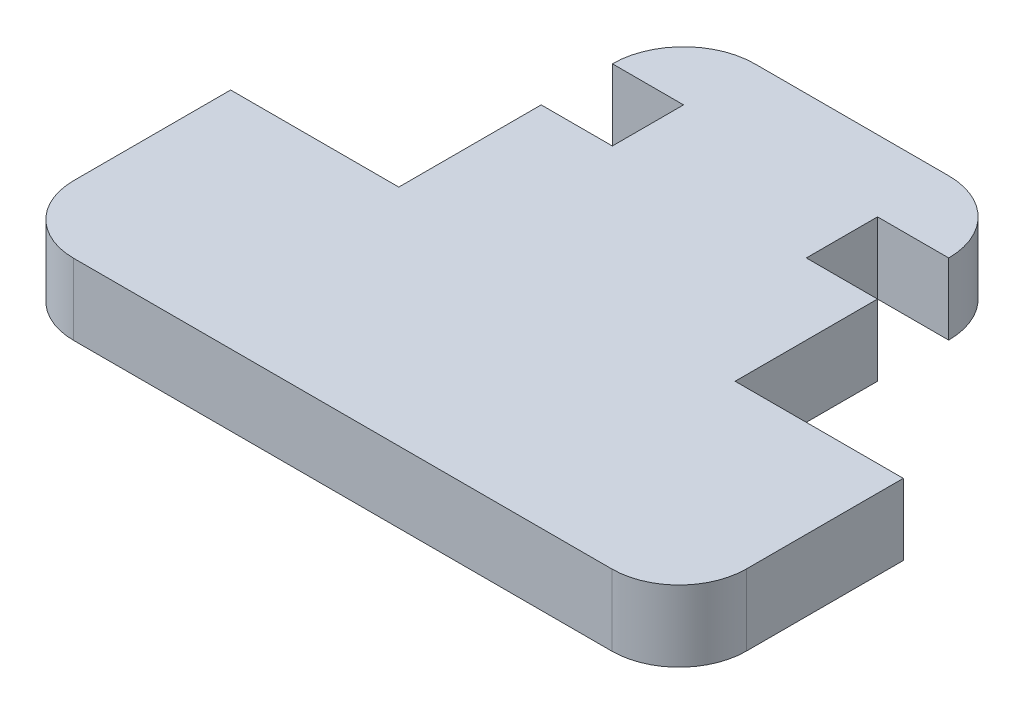
ISO-10303-21;
HEADER;
FILE_DESCRIPTION(('STEP AP214'),'2;1');
FILE_NAME('part.step','',(''),(''),'','','');
FILE_SCHEMA(('AUTOMOTIVE_DESIGN { 1 0 10303 214 1 1 1 1 }'));
ENDSEC;
DATA;
#1=APPLICATION_CONTEXT('core data for automotive mechanical design processes');
#2=APPLICATION_PROTOCOL_DEFINITION('international standard','automotive_design',2000,#1);
#3=PRODUCT_CONTEXT('',#1,'mechanical');
#4=PRODUCT('Part','Part','',(#3));
#5=PRODUCT_RELATED_PRODUCT_CATEGORY('part','',(#4));
#6=PRODUCT_DEFINITION_FORMATION('','',#4);
#7=PRODUCT_DEFINITION_CONTEXT('part definition',#1,'design');
#8=PRODUCT_DEFINITION('design','',#6,#7);
#9=PRODUCT_DEFINITION_SHAPE('','',#8);
#10=(LENGTH_UNIT() NAMED_UNIT(*) SI_UNIT(.MILLI.,.METRE.));
#11=(NAMED_UNIT(*) PLANE_ANGLE_UNIT() SI_UNIT($,.RADIAN.));
#12=(NAMED_UNIT(*) SI_UNIT($,.STERADIAN.) SOLID_ANGLE_UNIT());
#13=UNCERTAINTY_MEASURE_WITH_UNIT(LENGTH_MEASURE(1.E-05),#10,'distance_accuracy_value','');
#14=(GEOMETRIC_REPRESENTATION_CONTEXT(3) GLOBAL_UNCERTAINTY_ASSIGNED_CONTEXT((#13)) GLOBAL_UNIT_ASSIGNED_CONTEXT((#10,
#11,#12)) REPRESENTATION_CONTEXT('',''));
#15=CARTESIAN_POINT('',(0.,0.,0.));
#16=DIRECTION('',(0.,0.,1.));
#17=DIRECTION('',(1.,0.,0.));
#18=AXIS2_PLACEMENT_3D('',#15,#16,#17);
#19=CARTESIAN_POINT('',(0.,3.175,0.));
#20=DIRECTION('',(0.,0.,-1.));
#21=DIRECTION('',(-1.,0.,0.));
#22=AXIS2_PLACEMENT_3D('',#19,#20,#21);
#23=PLANE('',#22);
#24=DIRECTION('',(1.,0.,0.));
#25=VECTOR('',#24,1.);
#26=CARTESIAN_POINT('',(0.,0.,0.));
#27=LINE('',#26,#25);
#28=CARTESIAN_POINT('',(-15.,0.,0.));
#29=VERTEX_POINT('',#28);
#30=CARTESIAN_POINT('',(-7.5,0.,0.));
#31=VERTEX_POINT('',#30);
#32=EDGE_CURVE('E168',#29,#31,#27,.T.);
#33=ORIENTED_EDGE('',*,*,#32,.F.);
#34=DIRECTION('',(0.,-1.,0.));
#35=VECTOR('',#34,1.);
#36=CARTESIAN_POINT('',(-15.,3.175,0.));
#37=LINE('',#36,#35);
#38=CARTESIAN_POINT('',(-15.,3.175,0.));
#39=VERTEX_POINT('',#38);
#40=EDGE_CURVE('E163',#39,#29,#37,.T.);
#41=ORIENTED_EDGE('',*,*,#40,.F.);
#42=DIRECTION('',(1.,0.,0.));
#43=VECTOR('',#42,1.);
#44=CARTESIAN_POINT('',(0.,3.175,0.));
#45=LINE('',#44,#43);
#46=CARTESIAN_POINT('',(-7.5,3.175,0.));
#47=VERTEX_POINT('',#46);
#48=EDGE_CURVE('E165',#39,#47,#45,.T.);
#49=ORIENTED_EDGE('',*,*,#48,.T.);
#50=DIRECTION('',(0.,-1.,0.));
#51=VECTOR('',#50,1.);
#52=CARTESIAN_POINT('',(-7.5,3.175,0.));
#53=LINE('',#52,#51);
#54=EDGE_CURVE('E226',#47,#31,#53,.T.);
#55=ORIENTED_EDGE('',*,*,#54,.T.);
#56=EDGE_LOOP('',(#33,#41,#49,#55));
#57=FACE_BOUND('',#56,.T.);
#58=ADVANCED_FACE('F36',(#57),#23,.T.);
#59=CARTESIAN_POINT('',(-15.,3.175,0.));
#60=DIRECTION('',(1.,0.,0.));
#61=DIRECTION('',(0.,0.,-1.));
#62=AXIS2_PLACEMENT_3D('',#59,#60,#61);
#63=PLANE('',#62);
#64=DIRECTION('',(0.,0.,1.));
#65=VECTOR('',#64,1.);
#66=CARTESIAN_POINT('',(-15.,0.,0.));
#67=LINE('',#66,#65);
#68=CARTESIAN_POINT('',(-15.,0.,7.));
#69=VERTEX_POINT('',#68);
#70=EDGE_CURVE('E228',#29,#69,#67,.T.);
#71=ORIENTED_EDGE('',*,*,#70,.T.);
#72=DIRECTION('',(0.,-1.,0.));
#73=VECTOR('',#72,1.);
#74=CARTESIAN_POINT('',(-15.,3.175,7.));
#75=LINE('',#74,#73);
#76=CARTESIAN_POINT('',(-15.,3.175,7.));
#77=VERTEX_POINT('',#76);
#78=EDGE_CURVE('E11',#69,#77,#75,.F.);
#79=ORIENTED_EDGE('',*,*,#78,.T.);
#80=DIRECTION('',(0.,0.,1.));
#81=VECTOR('',#80,1.);
#82=CARTESIAN_POINT('',(-15.,3.175,0.));
#83=LINE('',#82,#81);
#84=EDGE_CURVE('E173',#39,#77,#83,.T.);
#85=ORIENTED_EDGE('',*,*,#84,.F.);
#86=ORIENTED_EDGE('',*,*,#40,.T.);
#87=EDGE_LOOP('',(#71,#79,#85,#86));
#88=FACE_BOUND('',#87,.T.);
#89=ADVANCED_FACE('F174',(#88),#63,.F.);
#90=CARTESIAN_POINT('',(0.,3.175,10.));
#91=DIRECTION('',(0.,0.,-1.));
#92=DIRECTION('',(-1.,0.,0.));
#93=AXIS2_PLACEMENT_3D('',#90,#91,#92);
#94=PLANE('',#93);
#95=DIRECTION('',(1.,0.,0.));
#96=VECTOR('',#95,1.);
#97=CARTESIAN_POINT('',(0.,0.,10.));
#98=LINE('',#97,#96);
#99=CARTESIAN_POINT('',(-12.,0.,10.));
#100=VERTEX_POINT('',#99);
#101=CARTESIAN_POINT('',(12.,0.,10.));
#102=VERTEX_POINT('',#101);
#103=EDGE_CURVE('E231',#100,#102,#98,.T.);
#104=ORIENTED_EDGE('',*,*,#103,.T.);
#105=DIRECTION('',(0.,-1.,0.));
#106=VECTOR('',#105,1.);
#107=CARTESIAN_POINT('',(12.,3.175,10.));
#108=LINE('',#107,#106);
#109=CARTESIAN_POINT('',(12.,3.175,10.));
#110=VERTEX_POINT('',#109);
#111=EDGE_CURVE('E57',#102,#110,#108,.F.);
#112=ORIENTED_EDGE('',*,*,#111,.T.);
#113=DIRECTION('',(1.,0.,0.));
#114=VECTOR('',#113,1.);
#115=CARTESIAN_POINT('',(0.,3.175,10.));
#116=LINE('',#115,#114);
#117=CARTESIAN_POINT('',(-12.,3.175,10.));
#118=VERTEX_POINT('',#117);
#119=EDGE_CURVE('E177',#118,#110,#116,.T.);
#120=ORIENTED_EDGE('',*,*,#119,.F.);
#121=DIRECTION('',(0.,-1.,0.));
#122=VECTOR('',#121,1.);
#123=CARTESIAN_POINT('',(-12.,3.175,10.));
#124=LINE('',#123,#122);
#125=EDGE_CURVE('E290',#118,#100,#124,.T.);
#126=ORIENTED_EDGE('',*,*,#125,.T.);
#127=EDGE_LOOP('',(#104,#112,#120,#126));
#128=FACE_BOUND('',#127,.T.);
#129=ADVANCED_FACE('F355',(#128),#94,.F.);
#130=CARTESIAN_POINT('',(15.,3.175,0.));
#131=DIRECTION('',(1.,0.,0.));
#132=DIRECTION('',(0.,0.,-1.));
#133=AXIS2_PLACEMENT_3D('',#130,#131,#132);
#134=PLANE('',#133);
#135=DIRECTION('',(0.,0.,1.));
#136=VECTOR('',#135,1.);
#137=CARTESIAN_POINT('',(15.,3.175,0.));
#138=LINE('',#137,#136);
#139=CARTESIAN_POINT('',(15.,3.175,0.));
#140=VERTEX_POINT('',#139);
#141=CARTESIAN_POINT('',(15.,3.175,7.));
#142=VERTEX_POINT('',#141);
#143=EDGE_CURVE('E191',#140,#142,#138,.T.);
#144=ORIENTED_EDGE('',*,*,#143,.T.);
#145=DIRECTION('',(0.,-1.,0.));
#146=VECTOR('',#145,1.);
#147=CARTESIAN_POINT('',(15.,0.,7.));
#148=LINE('',#147,#146);
#149=CARTESIAN_POINT('',(15.,0.,7.));
#150=VERTEX_POINT('',#149);
#151=EDGE_CURVE('E170',#142,#150,#148,.T.);
#152=ORIENTED_EDGE('',*,*,#151,.T.);
#153=DIRECTION('',(0.,0.,1.));
#154=VECTOR('',#153,1.);
#155=CARTESIAN_POINT('',(15.,0.,0.));
#156=LINE('',#155,#154);
#157=CARTESIAN_POINT('',(15.,0.,0.));
#158=VERTEX_POINT('',#157);
#159=EDGE_CURVE('E233',#158,#150,#156,.T.);
#160=ORIENTED_EDGE('',*,*,#159,.F.);
#161=DIRECTION('',(0.,-1.,0.));
#162=VECTOR('',#161,1.);
#163=CARTESIAN_POINT('',(15.,3.175,0.));
#164=LINE('',#163,#162);
#165=EDGE_CURVE('E171',#140,#158,#164,.T.);
#166=ORIENTED_EDGE('',*,*,#165,.F.);
#167=EDGE_LOOP('',(#144,#152,#160,#166));
#168=FACE_BOUND('',#167,.T.);
#169=ADVANCED_FACE('F299',(#168),#134,.T.);
#170=CARTESIAN_POINT('',(7.5,0.,0.));
#171=VERTEX_POINT('',#170);
#172=EDGE_CURVE('E229',#171,#158,#27,.T.);
#173=ORIENTED_EDGE('',*,*,#172,.F.);
#174=DIRECTION('',(0.,-1.,0.));
#175=VECTOR('',#174,1.);
#176=CARTESIAN_POINT('',(7.5,3.175,0.));
#177=LINE('',#176,#175);
#178=CARTESIAN_POINT('',(7.5,3.175,0.));
#179=VERTEX_POINT('',#178);
#180=EDGE_CURVE('E282',#179,#171,#177,.T.);
#181=ORIENTED_EDGE('',*,*,#180,.F.);
#182=EDGE_CURVE('E185',#179,#140,#45,.T.);
#183=ORIENTED_EDGE('',*,*,#182,.T.);
#184=ORIENTED_EDGE('',*,*,#165,.T.);
#185=EDGE_LOOP('',(#173,#181,#183,#184));
#186=FACE_BOUND('',#185,.T.);
#187=ADVANCED_FACE('F306',(#186),#23,.T.);
#188=CARTESIAN_POINT('',(7.5,3.175,0.));
#189=DIRECTION('',(-1.,0.,0.));
#190=DIRECTION('',(0.,0.,1.));
#191=AXIS2_PLACEMENT_3D('',#188,#189,#190);
#192=PLANE('',#191);
#193=DIRECTION('',(0.,0.,-1.));
#194=VECTOR('',#193,1.);
#195=CARTESIAN_POINT('',(7.5,0.,0.));
#196=LINE('',#195,#194);
#197=CARTESIAN_POINT('',(7.5,0.,-6.35));
#198=VERTEX_POINT('',#197);
#199=EDGE_CURVE('E236',#171,#198,#196,.T.);
#200=ORIENTED_EDGE('',*,*,#199,.T.);
#201=DIRECTION('',(0.,-1.,0.));
#202=VECTOR('',#201,1.);
#203=CARTESIAN_POINT('',(7.5,3.175,-6.35));
#204=LINE('',#203,#202);
#205=CARTESIAN_POINT('',(7.5,3.175,-6.35));
#206=VERTEX_POINT('',#205);
#207=EDGE_CURVE('E280',#206,#198,#204,.T.);
#208=ORIENTED_EDGE('',*,*,#207,.F.);
#209=DIRECTION('',(0.,0.,-1.));
#210=VECTOR('',#209,1.);
#211=CARTESIAN_POINT('',(7.5,3.175,0.));
#212=LINE('',#211,#210);
#213=EDGE_CURVE('E190',#179,#206,#212,.T.);
#214=ORIENTED_EDGE('',*,*,#213,.F.);
#215=ORIENTED_EDGE('',*,*,#180,.T.);
#216=EDGE_LOOP('',(#200,#208,#214,#215));
#217=FACE_BOUND('',#216,.T.);
#218=ADVANCED_FACE('F310',(#217),#192,.F.);
#219=CARTESIAN_POINT('',(0.,3.175,-6.35));
#220=DIRECTION('',(0.,0.,-1.));
#221=DIRECTION('',(-1.,0.,0.));
#222=AXIS2_PLACEMENT_3D('',#219,#220,#221);
#223=PLANE('',#222);
#224=DIRECTION('',(1.,0.,0.));
#225=VECTOR('',#224,1.);
#226=CARTESIAN_POINT('',(0.,0.,-6.35));
#227=LINE('',#226,#225);
#228=CARTESIAN_POINT('',(4.325,0.,-6.35));
#229=VERTEX_POINT('',#228);
#230=EDGE_CURVE('E239',#229,#198,#227,.T.);
#231=ORIENTED_EDGE('',*,*,#230,.F.);
#232=DIRECTION('',(0.,-1.,0.));
#233=VECTOR('',#232,1.);
#234=CARTESIAN_POINT('',(4.325,3.175,-6.35));
#235=LINE('',#234,#233);
#236=CARTESIAN_POINT('',(4.325,3.175,-6.35));
#237=VERTEX_POINT('',#236);
#238=EDGE_CURVE('E278',#237,#229,#235,.T.);
#239=ORIENTED_EDGE('',*,*,#238,.F.);
#240=DIRECTION('',(1.,0.,0.));
#241=VECTOR('',#240,1.);
#242=CARTESIAN_POINT('',(0.,3.175,-6.35));
#243=LINE('',#242,#241);
#244=EDGE_CURVE('E194',#237,#206,#243,.T.);
#245=ORIENTED_EDGE('',*,*,#244,.T.);
#246=ORIENTED_EDGE('',*,*,#207,.T.);
#247=EDGE_LOOP('',(#231,#239,#245,#246));
#248=FACE_BOUND('',#247,.T.);
#249=ADVANCED_FACE('F373',(#248),#223,.T.);
#250=CARTESIAN_POINT('',(4.325,3.175,0.));
#251=DIRECTION('',(1.,0.,0.));
#252=DIRECTION('',(0.,0.,-1.));
#253=AXIS2_PLACEMENT_3D('',#250,#251,#252);
#254=PLANE('',#253);
#255=DIRECTION('',(0.,0.,1.));
#256=VECTOR('',#255,1.);
#257=CARTESIAN_POINT('',(4.325,0.,0.));
#258=LINE('',#257,#256);
#259=CARTESIAN_POINT('',(4.325,0.,-9.525));
#260=VERTEX_POINT('',#259);
#261=EDGE_CURVE('E242',#260,#229,#258,.T.);
#262=ORIENTED_EDGE('',*,*,#261,.F.);
#263=DIRECTION('',(0.,-1.,0.));
#264=VECTOR('',#263,1.);
#265=CARTESIAN_POINT('',(4.325,3.175,-9.525));
#266=LINE('',#265,#264);
#267=CARTESIAN_POINT('',(4.325,3.175,-9.525));
#268=VERTEX_POINT('',#267);
#269=EDGE_CURVE('E276',#268,#260,#266,.T.);
#270=ORIENTED_EDGE('',*,*,#269,.F.);
#271=DIRECTION('',(0.,0.,1.));
#272=VECTOR('',#271,1.);
#273=CARTESIAN_POINT('',(4.325,3.175,0.));
#274=LINE('',#273,#272);
#275=EDGE_CURVE('E206',#268,#237,#274,.T.);
#276=ORIENTED_EDGE('',*,*,#275,.T.);
#277=ORIENTED_EDGE('',*,*,#238,.T.);
#278=EDGE_LOOP('',(#262,#270,#276,#277));
#279=FACE_BOUND('',#278,.T.);
#280=ADVANCED_FACE('F317',(#279),#254,.T.);
#281=CARTESIAN_POINT('',(0.,3.175,-9.525));
#282=DIRECTION('',(0.,0.,1.));
#283=DIRECTION('',(1.,0.,0.));
#284=AXIS2_PLACEMENT_3D('',#281,#282,#283);
#285=PLANE('',#284);
#286=DIRECTION('',(-1.,0.,0.));
#287=VECTOR('',#286,1.);
#288=CARTESIAN_POINT('',(0.,0.,-9.525));
#289=LINE('',#288,#287);
#290=CARTESIAN_POINT('',(7.5,0.,-9.525));
#291=VERTEX_POINT('',#290);
#292=EDGE_CURVE('E245',#291,#260,#289,.T.);
#293=ORIENTED_EDGE('',*,*,#292,.F.);
#294=DIRECTION('',(0.,-1.,0.));
#295=VECTOR('',#294,1.);
#296=CARTESIAN_POINT('',(7.5,3.175,-9.525));
#297=LINE('',#296,#295);
#298=CARTESIAN_POINT('',(7.5,3.175,-9.525));
#299=VERTEX_POINT('',#298);
#300=EDGE_CURVE('E274',#299,#291,#297,.T.);
#301=ORIENTED_EDGE('',*,*,#300,.F.);
#302=DIRECTION('',(-1.,0.,0.));
#303=VECTOR('',#302,1.);
#304=CARTESIAN_POINT('',(0.,3.175,-9.525));
#305=LINE('',#304,#303);
#306=EDGE_CURVE('E210',#299,#268,#305,.T.);
#307=ORIENTED_EDGE('',*,*,#306,.T.);
#308=ORIENTED_EDGE('',*,*,#269,.T.);
#309=EDGE_LOOP('',(#293,#301,#307,#308));
#310=FACE_BOUND('',#309,.T.);
#311=ADVANCED_FACE('F321',(#310),#285,.T.);
#312=CARTESIAN_POINT('',(4.325,3.175,-9.525));
#313=DIRECTION('',(0.,-1.,0.));
#314=DIRECTION('',(0.,0.,-1.));
#315=AXIS2_PLACEMENT_3D('',#312,#313,#314);
#316=CYLINDRICAL_SURFACE('',#315,3.175);
#317=CARTESIAN_POINT('',(4.325,0.,-9.525));
#318=DIRECTION('',(0.,1.,0.));
#319=DIRECTION('',(0.,0.,1.));
#320=AXIS2_PLACEMENT_3D('',#317,#318,#319);
#321=CIRCLE('',#320,3.175);
#322=CARTESIAN_POINT('',(4.325,0.,-12.7));
#323=VERTEX_POINT('',#322);
#324=EDGE_CURVE('E248',#291,#323,#321,.T.);
#325=ORIENTED_EDGE('',*,*,#324,.T.);
#326=DIRECTION('',(0.,-1.,0.));
#327=VECTOR('',#326,1.);
#328=CARTESIAN_POINT('',(4.325,3.175,-12.7));
#329=LINE('',#328,#327);
#330=CARTESIAN_POINT('',(4.325,3.175,-12.7));
#331=VERTEX_POINT('',#330);
#332=EDGE_CURVE('E272',#331,#323,#329,.T.);
#333=ORIENTED_EDGE('',*,*,#332,.F.);
#334=CARTESIAN_POINT('',(4.325,3.175,-9.525));
#335=DIRECTION('',(0.,1.,0.));
#336=DIRECTION('',(0.,0.,1.));
#337=AXIS2_PLACEMENT_3D('',#334,#335,#336);
#338=CIRCLE('',#337,3.175);
#339=EDGE_CURVE('E213',#299,#331,#338,.T.);
#340=ORIENTED_EDGE('',*,*,#339,.F.);
#341=ORIENTED_EDGE('',*,*,#300,.T.);
#342=EDGE_LOOP('',(#325,#333,#340,#341));
#343=FACE_BOUND('',#342,.T.);
#344=ADVANCED_FACE('F327',(#343),#316,.T.);
#345=CARTESIAN_POINT('',(0.,3.175,-12.7));
#346=DIRECTION('',(0.,0.,-1.));
#347=DIRECTION('',(-1.,0.,0.));
#348=AXIS2_PLACEMENT_3D('',#345,#346,#347);
#349=PLANE('',#348);
#350=DIRECTION('',(1.,0.,0.));
#351=VECTOR('',#350,1.);
#352=CARTESIAN_POINT('',(0.,0.,-12.7));
#353=LINE('',#352,#351);
#354=CARTESIAN_POINT('',(-4.325,0.,-12.7));
#355=VERTEX_POINT('',#354);
#356=EDGE_CURVE('E252',#355,#323,#353,.T.);
#357=ORIENTED_EDGE('',*,*,#356,.F.);
#358=DIRECTION('',(0.,-1.,0.));
#359=VECTOR('',#358,1.);
#360=CARTESIAN_POINT('',(-4.325,3.175,-12.7));
#361=LINE('',#360,#359);
#362=CARTESIAN_POINT('',(-4.325,3.175,-12.7));
#363=VERTEX_POINT('',#362);
#364=EDGE_CURVE('E270',#363,#355,#361,.T.);
#365=ORIENTED_EDGE('',*,*,#364,.F.);
#366=DIRECTION('',(1.,0.,0.));
#367=VECTOR('',#366,1.);
#368=CARTESIAN_POINT('',(0.,3.175,-12.7));
#369=LINE('',#368,#367);
#370=EDGE_CURVE('E216',#363,#331,#369,.T.);
#371=ORIENTED_EDGE('',*,*,#370,.T.);
#372=ORIENTED_EDGE('',*,*,#332,.T.);
#373=EDGE_LOOP('',(#357,#365,#371,#372));
#374=FACE_BOUND('',#373,.T.);
#375=ADVANCED_FACE('F331',(#374),#349,.T.);
#376=CARTESIAN_POINT('',(-4.325,3.175,-9.525));
#377=DIRECTION('',(0.,-1.,0.));
#378=DIRECTION('',(0.,0.,-1.));
#379=AXIS2_PLACEMENT_3D('',#376,#377,#378);
#380=CYLINDRICAL_SURFACE('',#379,3.175);
#381=CARTESIAN_POINT('',(-4.325,0.,-9.525));
#382=DIRECTION('',(0.,1.,0.));
#383=DIRECTION('',(0.,0.,1.));
#384=AXIS2_PLACEMENT_3D('',#381,#382,#383);
#385=CIRCLE('',#384,3.175);
#386=CARTESIAN_POINT('',(-7.5,0.,-9.525));
#387=VERTEX_POINT('',#386);
#388=EDGE_CURVE('E255',#387,#355,#385,.F.);
#389=ORIENTED_EDGE('',*,*,#388,.F.);
#390=DIRECTION('',(0.,-1.,0.));
#391=VECTOR('',#390,1.);
#392=CARTESIAN_POINT('',(-7.5,3.175,-9.525));
#393=LINE('',#392,#391);
#394=CARTESIAN_POINT('',(-7.5,3.175,-9.525));
#395=VERTEX_POINT('',#394);
#396=EDGE_CURVE('E268',#395,#387,#393,.T.);
#397=ORIENTED_EDGE('',*,*,#396,.F.);
#398=CARTESIAN_POINT('',(-4.325,3.175,-9.525));
#399=DIRECTION('',(0.,1.,0.));
#400=DIRECTION('',(0.,0.,1.));
#401=AXIS2_PLACEMENT_3D('',#398,#399,#400);
#402=CIRCLE('',#401,3.175);
#403=EDGE_CURVE('E219',#395,#363,#402,.F.);
#404=ORIENTED_EDGE('',*,*,#403,.T.);
#405=ORIENTED_EDGE('',*,*,#364,.T.);
#406=EDGE_LOOP('',(#389,#397,#404,#405));
#407=FACE_BOUND('',#406,.T.);
#408=ADVANCED_FACE('F334',(#407),#380,.T.);
#409=CARTESIAN_POINT('',(-4.325,0.,-9.525));
#410=VERTEX_POINT('',#409);
#411=EDGE_CURVE('E249',#410,#387,#289,.T.);
#412=ORIENTED_EDGE('',*,*,#411,.F.);
#413=DIRECTION('',(0.,-1.,0.));
#414=VECTOR('',#413,1.);
#415=CARTESIAN_POINT('',(-4.325,3.175,-9.525));
#416=LINE('',#415,#414);
#417=CARTESIAN_POINT('',(-4.325,3.175,-9.525));
#418=VERTEX_POINT('',#417);
#419=EDGE_CURVE('E266',#418,#410,#416,.T.);
#420=ORIENTED_EDGE('',*,*,#419,.F.);
#421=EDGE_CURVE('E214',#418,#395,#305,.T.);
#422=ORIENTED_EDGE('',*,*,#421,.T.);
#423=ORIENTED_EDGE('',*,*,#396,.T.);
#424=EDGE_LOOP('',(#412,#420,#422,#423));
#425=FACE_BOUND('',#424,.T.);
#426=ADVANCED_FACE('F341',(#425),#285,.T.);
#427=CARTESIAN_POINT('',(-4.325,3.175,0.));
#428=DIRECTION('',(-1.,0.,0.));
#429=DIRECTION('',(0.,0.,1.));
#430=AXIS2_PLACEMENT_3D('',#427,#428,#429);
#431=PLANE('',#430);
#432=DIRECTION('',(0.,0.,-1.));
#433=VECTOR('',#432,1.);
#434=CARTESIAN_POINT('',(-4.325,0.,0.));
#435=LINE('',#434,#433);
#436=CARTESIAN_POINT('',(-4.325,0.,-6.35));
#437=VERTEX_POINT('',#436);
#438=EDGE_CURVE('E258',#437,#410,#435,.T.);
#439=ORIENTED_EDGE('',*,*,#438,.F.);
#440=DIRECTION('',(0.,-1.,0.));
#441=VECTOR('',#440,1.);
#442=CARTESIAN_POINT('',(-4.325,3.175,-6.35));
#443=LINE('',#442,#441);
#444=CARTESIAN_POINT('',(-4.325,3.175,-6.35));
#445=VERTEX_POINT('',#444);
#446=EDGE_CURVE('E264',#445,#437,#443,.T.);
#447=ORIENTED_EDGE('',*,*,#446,.F.);
#448=DIRECTION('',(0.,0.,-1.));
#449=VECTOR('',#448,1.);
#450=CARTESIAN_POINT('',(-4.325,3.175,0.));
#451=LINE('',#450,#449);
#452=EDGE_CURVE('E222',#445,#418,#451,.T.);
#453=ORIENTED_EDGE('',*,*,#452,.T.);
#454=ORIENTED_EDGE('',*,*,#419,.T.);
#455=EDGE_LOOP('',(#439,#447,#453,#454));
#456=FACE_BOUND('',#455,.T.);
#457=ADVANCED_FACE('F344',(#456),#431,.T.);
#458=CARTESIAN_POINT('',(-7.5,0.,-6.35));
#459=VERTEX_POINT('',#458);
#460=EDGE_CURVE('E187',#459,#437,#227,.T.);
#461=ORIENTED_EDGE('',*,*,#460,.F.);
#462=DIRECTION('',(0.,-1.,0.));
#463=VECTOR('',#462,1.);
#464=CARTESIAN_POINT('',(-7.5,3.175,-6.35));
#465=LINE('',#464,#463);
#466=CARTESIAN_POINT('',(-7.5,3.175,-6.35));
#467=VERTEX_POINT('',#466);
#468=EDGE_CURVE('E262',#467,#459,#465,.T.);
#469=ORIENTED_EDGE('',*,*,#468,.F.);
#470=EDGE_CURVE('E207',#467,#445,#243,.T.);
#471=ORIENTED_EDGE('',*,*,#470,.T.);
#472=ORIENTED_EDGE('',*,*,#446,.T.);
#473=EDGE_LOOP('',(#461,#469,#471,#472));
#474=FACE_BOUND('',#473,.T.);
#475=ADVANCED_FACE('F349',(#474),#223,.T.);
#476=CARTESIAN_POINT('',(-7.5,3.175,0.));
#477=DIRECTION('',(-1.,0.,0.));
#478=DIRECTION('',(0.,0.,1.));
#479=AXIS2_PLACEMENT_3D('',#476,#477,#478);
#480=PLANE('',#479);
#481=DIRECTION('',(0.,0.,-1.));
#482=VECTOR('',#481,1.);
#483=CARTESIAN_POINT('',(-7.5,0.,0.));
#484=LINE('',#483,#482);
#485=EDGE_CURVE('E183',#31,#459,#484,.T.);
#486=ORIENTED_EDGE('',*,*,#485,.F.);
#487=ORIENTED_EDGE('',*,*,#54,.F.);
#488=DIRECTION('',(0.,0.,-1.));
#489=VECTOR('',#488,1.);
#490=CARTESIAN_POINT('',(-7.5,3.175,0.));
#491=LINE('',#490,#489);
#492=EDGE_CURVE('E182',#47,#467,#491,.T.);
#493=ORIENTED_EDGE('',*,*,#492,.T.);
#494=ORIENTED_EDGE('',*,*,#468,.T.);
#495=EDGE_LOOP('',(#486,#487,#493,#494));
#496=FACE_BOUND('',#495,.T.);
#497=ADVANCED_FACE('F352',(#496),#480,.T.);
#498=CARTESIAN_POINT('',(0.,3.175,0.));
#499=DIRECTION('',(0.,1.,0.));
#500=DIRECTION('',(0.,0.,1.));
#501=AXIS2_PLACEMENT_3D('',#498,#499,#500);
#502=PLANE('',#501);
#503=ORIENTED_EDGE('',*,*,#119,.T.);
#504=CARTESIAN_POINT('',(12.,3.175,7.));
#505=DIRECTION('',(0.,1.,0.));
#506=DIRECTION('',(0.,0.,1.));
#507=AXIS2_PLACEMENT_3D('',#504,#505,#506);
#508=CIRCLE('',#507,3.);
#509=EDGE_CURVE('E44',#110,#142,#508,.T.);
#510=ORIENTED_EDGE('',*,*,#509,.T.);
#511=ORIENTED_EDGE('',*,*,#143,.F.);
#512=ORIENTED_EDGE('',*,*,#182,.F.);
#513=ORIENTED_EDGE('',*,*,#213,.T.);
#514=ORIENTED_EDGE('',*,*,#244,.F.);
#515=ORIENTED_EDGE('',*,*,#275,.F.);
#516=ORIENTED_EDGE('',*,*,#306,.F.);
#517=ORIENTED_EDGE('',*,*,#339,.T.);
#518=ORIENTED_EDGE('',*,*,#370,.F.);
#519=ORIENTED_EDGE('',*,*,#403,.F.);
#520=ORIENTED_EDGE('',*,*,#421,.F.);
#521=ORIENTED_EDGE('',*,*,#452,.F.);
#522=ORIENTED_EDGE('',*,*,#470,.F.);
#523=ORIENTED_EDGE('',*,*,#492,.F.);
#524=ORIENTED_EDGE('',*,*,#48,.F.);
#525=ORIENTED_EDGE('',*,*,#84,.T.);
#526=CARTESIAN_POINT('',(-12.,3.175,7.));
#527=DIRECTION('',(0.,1.,0.));
#528=DIRECTION('',(0.,0.,1.));
#529=AXIS2_PLACEMENT_3D('',#526,#527,#528);
#530=CIRCLE('',#529,3.);
#531=EDGE_CURVE('E294',#77,#118,#530,.T.);
#532=ORIENTED_EDGE('',*,*,#531,.T.);
#533=EDGE_LOOP('',(#503,#510,#511,#512,#513,#514,#515,#516,#517,#518,#519,#520,#521,#522,#523,
#524,#525,#532));
#534=FACE_BOUND('',#533,.T.);
#535=ADVANCED_FACE('F179',(#534),#502,.T.);
#536=CARTESIAN_POINT('',(0.,0.,0.));
#537=DIRECTION('',(0.,1.,0.));
#538=DIRECTION('',(0.,0.,1.));
#539=AXIS2_PLACEMENT_3D('',#536,#537,#538);
#540=PLANE('',#539);
#541=ORIENTED_EDGE('',*,*,#159,.T.);
#542=CARTESIAN_POINT('',(12.,0.,7.));
#543=DIRECTION('',(0.,1.,0.));
#544=DIRECTION('',(0.,0.,1.));
#545=AXIS2_PLACEMENT_3D('',#542,#543,#544);
#546=CIRCLE('',#545,3.);
#547=EDGE_CURVE('E288',#150,#102,#546,.F.);
#548=ORIENTED_EDGE('',*,*,#547,.T.);
#549=ORIENTED_EDGE('',*,*,#103,.F.);
#550=CARTESIAN_POINT('',(-12.,0.,7.));
#551=DIRECTION('',(0.,1.,0.));
#552=DIRECTION('',(0.,0.,1.));
#553=AXIS2_PLACEMENT_3D('',#550,#551,#552);
#554=CIRCLE('',#553,3.);
#555=EDGE_CURVE('E286',#100,#69,#554,.F.);
#556=ORIENTED_EDGE('',*,*,#555,.T.);
#557=ORIENTED_EDGE('',*,*,#70,.F.);
#558=ORIENTED_EDGE('',*,*,#32,.T.);
#559=ORIENTED_EDGE('',*,*,#485,.T.);
#560=ORIENTED_EDGE('',*,*,#460,.T.);
#561=ORIENTED_EDGE('',*,*,#438,.T.);
#562=ORIENTED_EDGE('',*,*,#411,.T.);
#563=ORIENTED_EDGE('',*,*,#388,.T.);
#564=ORIENTED_EDGE('',*,*,#356,.T.);
#565=ORIENTED_EDGE('',*,*,#324,.F.);
#566=ORIENTED_EDGE('',*,*,#292,.T.);
#567=ORIENTED_EDGE('',*,*,#261,.T.);
#568=ORIENTED_EDGE('',*,*,#230,.T.);
#569=ORIENTED_EDGE('',*,*,#199,.F.);
#570=ORIENTED_EDGE('',*,*,#172,.T.);
#571=EDGE_LOOP('',(#541,#548,#549,#556,#557,#558,#559,#560,#561,#562,#563,#564,#565,#566,#567,
#568,#569,#570));
#572=FACE_BOUND('',#571,.T.);
#573=ADVANCED_FACE('F302',(#572),#540,.F.);
#574=CARTESIAN_POINT('',(12.,3.175,7.));
#575=DIRECTION('',(0.,1.,0.));
#576=DIRECTION('',(0.,0.,1.));
#577=AXIS2_PLACEMENT_3D('',#574,#575,#576);
#578=CYLINDRICAL_SURFACE('',#577,3.);
#579=ORIENTED_EDGE('',*,*,#509,.F.);
#580=ORIENTED_EDGE('',*,*,#111,.F.);
#581=ORIENTED_EDGE('',*,*,#547,.F.);
#582=ORIENTED_EDGE('',*,*,#151,.F.);
#583=EDGE_LOOP('',(#579,#580,#581,#582));
#584=FACE_BOUND('',#583,.T.);
#585=ADVANCED_FACE('F297',(#584),#578,.T.);
#586=CARTESIAN_POINT('',(-12.,3.175,7.));
#587=DIRECTION('',(0.,-1.,0.));
#588=DIRECTION('',(0.,0.,-1.));
#589=AXIS2_PLACEMENT_3D('',#586,#587,#588);
#590=CYLINDRICAL_SURFACE('',#589,3.);
#591=ORIENTED_EDGE('',*,*,#531,.F.);
#592=ORIENTED_EDGE('',*,*,#78,.F.);
#593=ORIENTED_EDGE('',*,*,#555,.F.);
#594=ORIENTED_EDGE('',*,*,#125,.F.);
#595=EDGE_LOOP('',(#591,#592,#593,#594));
#596=FACE_BOUND('',#595,.T.);
#597=ADVANCED_FACE('F38',(#596),#590,.T.);
#598=CLOSED_SHELL('',(#58,#89,#129,#169,#187,#218,#249,#280,#311,#344,#375,#408,#426,#457,#475,
#497,#535,#573,#585,#597));
#599=MANIFOLD_SOLID_BREP('B2',#598);
#600=ADVANCED_BREP_SHAPE_REPRESENTATION('',(#18,#599),#14);
#601=SHAPE_DEFINITION_REPRESENTATION(#9,#600);
ENDSEC;
END-ISO-10303-21;
